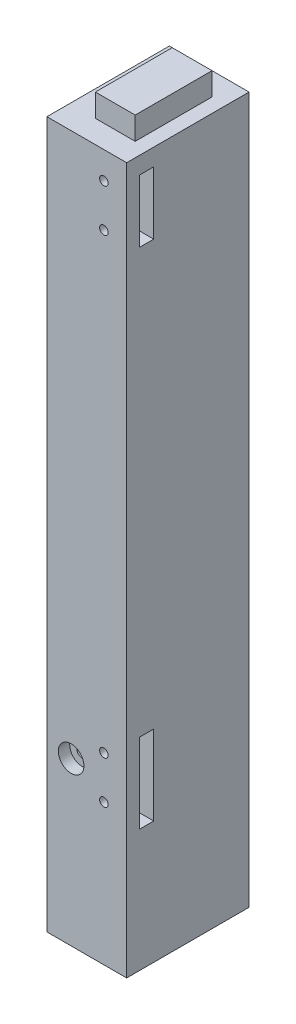
ISO-10303-21;
HEADER;
FILE_DESCRIPTION(('STEP AP214'),'2;1');
FILE_NAME('part.step','',(''),(''),'','','');
FILE_SCHEMA(('AUTOMOTIVE_DESIGN { 1 0 10303 214 1 1 1 1 }'));
ENDSEC;
DATA;
#1=APPLICATION_CONTEXT('core data for automotive mechanical design processes');
#2=APPLICATION_PROTOCOL_DEFINITION('international standard','automotive_design',2000,#1);
#3=PRODUCT_CONTEXT('',#1,'mechanical');
#4=PRODUCT('Part','Part','',(#3));
#5=PRODUCT_RELATED_PRODUCT_CATEGORY('part','',(#4));
#6=PRODUCT_DEFINITION_FORMATION('','',#4);
#7=PRODUCT_DEFINITION_CONTEXT('part definition',#1,'design');
#8=PRODUCT_DEFINITION('design','',#6,#7);
#9=PRODUCT_DEFINITION_SHAPE('','',#8);
#10=(LENGTH_UNIT() NAMED_UNIT(*) SI_UNIT(.MILLI.,.METRE.));
#11=(NAMED_UNIT(*) PLANE_ANGLE_UNIT() SI_UNIT($,.RADIAN.));
#12=(NAMED_UNIT(*) SI_UNIT($,.STERADIAN.) SOLID_ANGLE_UNIT());
#13=UNCERTAINTY_MEASURE_WITH_UNIT(LENGTH_MEASURE(1.E-05),#10,'distance_accuracy_value','');
#14=(GEOMETRIC_REPRESENTATION_CONTEXT(3) GLOBAL_UNCERTAINTY_ASSIGNED_CONTEXT((#13)) GLOBAL_UNIT_ASSIGNED_CONTEXT((#10,
#11,#12)) REPRESENTATION_CONTEXT('',''));
#15=CARTESIAN_POINT('',(0.,0.,0.));
#16=DIRECTION('',(0.,0.,1.));
#17=DIRECTION('',(1.,0.,0.));
#18=AXIS2_PLACEMENT_3D('',#15,#16,#17);
#19=CARTESIAN_POINT('',(-44.45,393.7,136.525));
#20=DIRECTION('',(1.,0.,0.));
#21=DIRECTION('',(0.,1.,0.));
#22=AXIS2_PLACEMENT_3D('',#19,#20,#21);
#23=PLANE('',#22);
#24=DIRECTION('',(0.,-1.,0.));
#25=VECTOR('',#24,1.);
#26=CARTESIAN_POINT('',(-44.45,393.7,0.));
#27=LINE('',#26,#25);
#28=CARTESIAN_POINT('',(-44.45,393.7,0.));
#29=VERTEX_POINT('',#28);
#30=CARTESIAN_POINT('',(-44.4499999999999,-393.7,0.));
#31=VERTEX_POINT('',#30);
#32=EDGE_CURVE('E298',#29,#31,#27,.T.);
#33=ORIENTED_EDGE('',*,*,#32,.T.);
#34=DIRECTION('',(0.,0.,-1.));
#35=VECTOR('',#34,1.);
#36=CARTESIAN_POINT('',(-44.4499999999999,-393.7,136.525));
#37=LINE('',#36,#35);
#38=CARTESIAN_POINT('',(-44.4499999999999,-393.7,136.525));
#39=VERTEX_POINT('',#38);
#40=EDGE_CURVE('E11',#39,#31,#37,.T.);
#41=ORIENTED_EDGE('',*,*,#40,.F.);
#42=DIRECTION('',(0.,-1.,0.));
#43=VECTOR('',#42,1.);
#44=CARTESIAN_POINT('',(-44.45,393.7,136.525));
#45=LINE('',#44,#43);
#46=CARTESIAN_POINT('',(-44.45,393.7,136.525));
#47=VERTEX_POINT('',#46);
#48=EDGE_CURVE('E306',#47,#39,#45,.T.);
#49=ORIENTED_EDGE('',*,*,#48,.F.);
#50=DIRECTION('',(0.,0.,-1.));
#51=VECTOR('',#50,1.);
#52=CARTESIAN_POINT('',(-44.45,393.7,136.525));
#53=LINE('',#52,#51);
#54=EDGE_CURVE('E316',#47,#29,#53,.T.);
#55=ORIENTED_EDGE('',*,*,#54,.T.);
#56=EDGE_LOOP('',(#33,#41,#49,#55));
#57=FACE_BOUND('',#56,.T.);
#58=ADVANCED_FACE('F33',(#57),#23,.F.);
#59=CARTESIAN_POINT('',(44.4500000000001,-393.7,136.525));
#60=DIRECTION('',(0.,1.,0.));
#61=DIRECTION('',(0.,0.,1.));
#62=AXIS2_PLACEMENT_3D('',#59,#60,#61);
#63=PLANE('',#62);
#64=DIRECTION('',(1.,0.,0.));
#65=VECTOR('',#64,1.);
#66=CARTESIAN_POINT('',(44.4500000000001,-393.7,0.));
#67=LINE('',#66,#65);
#68=CARTESIAN_POINT('',(44.4500000000001,-393.7,0.));
#69=VERTEX_POINT('',#68);
#70=EDGE_CURVE('E319',#31,#69,#67,.T.);
#71=ORIENTED_EDGE('',*,*,#70,.T.);
#72=DIRECTION('',(0.,0.,-1.));
#73=VECTOR('',#72,1.);
#74=CARTESIAN_POINT('',(44.4500000000001,-393.7,136.525));
#75=LINE('',#74,#73);
#76=CARTESIAN_POINT('',(44.4500000000001,-393.7,136.525));
#77=VERTEX_POINT('',#76);
#78=EDGE_CURVE('E41',#77,#69,#75,.T.);
#79=ORIENTED_EDGE('',*,*,#78,.F.);
#80=DIRECTION('',(1.,0.,0.));
#81=VECTOR('',#80,1.);
#82=CARTESIAN_POINT('',(44.4500000000001,-393.7,136.525));
#83=LINE('',#82,#81);
#84=EDGE_CURVE('E309',#39,#77,#83,.T.);
#85=ORIENTED_EDGE('',*,*,#84,.F.);
#86=ORIENTED_EDGE('',*,*,#40,.T.);
#87=EDGE_LOOP('',(#71,#79,#85,#86));
#88=FACE_BOUND('',#87,.T.);
#89=ADVANCED_FACE('F393',(#88),#63,.F.);
#90=CARTESIAN_POINT('',(44.45,393.7,136.525));
#91=DIRECTION('',(-1.,0.,0.));
#92=DIRECTION('',(0.,-1.,0.));
#93=AXIS2_PLACEMENT_3D('',#90,#91,#92);
#94=PLANE('',#93);
#95=DIRECTION('',(0.,0.,1.));
#96=VECTOR('',#95,1.);
#97=CARTESIAN_POINT('',(44.45,374.65,122.2375));
#98=LINE('',#97,#96);
#99=CARTESIAN_POINT('',(44.45,374.65,106.3625));
#100=VERTEX_POINT('',#99);
#101=CARTESIAN_POINT('',(44.45,374.65,122.2375));
#102=VERTEX_POINT('',#101);
#103=EDGE_CURVE('E228',#100,#102,#98,.T.);
#104=ORIENTED_EDGE('',*,*,#103,.F.);
#105=DIRECTION('',(0.,1.,0.));
#106=VECTOR('',#105,1.);
#107=CARTESIAN_POINT('',(44.45,374.65,106.3625));
#108=LINE('',#107,#106);
#109=CARTESIAN_POINT('',(44.45,304.8,106.3625));
#110=VERTEX_POINT('',#109);
#111=EDGE_CURVE('E57',#110,#100,#108,.T.);
#112=ORIENTED_EDGE('',*,*,#111,.F.);
#113=DIRECTION('',(0.,0.,-1.));
#114=VECTOR('',#113,1.);
#115=CARTESIAN_POINT('',(44.45,304.8,122.2375));
#116=LINE('',#115,#114);
#117=CARTESIAN_POINT('',(44.45,304.8,122.2375));
#118=VERTEX_POINT('',#117);
#119=EDGE_CURVE('E217',#118,#110,#116,.T.);
#120=ORIENTED_EDGE('',*,*,#119,.F.);
#121=DIRECTION('',(0.,-1.,0.));
#122=VECTOR('',#121,1.);
#123=CARTESIAN_POINT('',(44.45,374.65,122.2375));
#124=LINE('',#123,#122);
#125=EDGE_CURVE('E231',#102,#118,#124,.T.);
#126=ORIENTED_EDGE('',*,*,#125,.F.);
#127=EDGE_LOOP('',(#104,#112,#120,#126));
#128=FACE_BOUND('',#127,.T.);
#129=DIRECTION('',(0.,0.,1.));
#130=VECTOR('',#129,1.);
#131=CARTESIAN_POINT('',(44.45,-168.275,122.2375));
#132=LINE('',#131,#130);
#133=CARTESIAN_POINT('',(44.45,-168.275,106.3625));
#134=VERTEX_POINT('',#133);
#135=CARTESIAN_POINT('',(44.45,-168.275,122.2375));
#136=VERTEX_POINT('',#135);
#137=EDGE_CURVE('E259',#134,#136,#132,.T.);
#138=ORIENTED_EDGE('',*,*,#137,.F.);
#139=DIRECTION('',(0.,1.,0.));
#140=VECTOR('',#139,1.);
#141=CARTESIAN_POINT('',(44.45,-168.275,106.3625));
#142=LINE('',#141,#140);
#143=CARTESIAN_POINT('',(44.45,-257.175,106.3625));
#144=VERTEX_POINT('',#143);
#145=EDGE_CURVE('E238',#144,#134,#142,.T.);
#146=ORIENTED_EDGE('',*,*,#145,.F.);
#147=DIRECTION('',(0.,0.,-1.));
#148=VECTOR('',#147,1.);
#149=CARTESIAN_POINT('',(44.45,-257.175,122.2375));
#150=LINE('',#149,#148);
#151=CARTESIAN_POINT('',(44.45,-257.175,122.2375));
#152=VERTEX_POINT('',#151);
#153=EDGE_CURVE('E248',#152,#144,#150,.T.);
#154=ORIENTED_EDGE('',*,*,#153,.F.);
#155=DIRECTION('',(0.,-1.,0.));
#156=VECTOR('',#155,1.);
#157=CARTESIAN_POINT('',(44.45,-168.275,122.2375));
#158=LINE('',#157,#156);
#159=EDGE_CURVE('E262',#136,#152,#158,.T.);
#160=ORIENTED_EDGE('',*,*,#159,.F.);
#161=EDGE_LOOP('',(#138,#146,#154,#160));
#162=FACE_BOUND('',#161,.T.);
#163=DIRECTION('',(0.,1.,0.));
#164=VECTOR('',#163,1.);
#165=CARTESIAN_POINT('',(44.45,393.7,0.));
#166=LINE('',#165,#164);
#167=CARTESIAN_POINT('',(44.45,393.7,0.));
#168=VERTEX_POINT('',#167);
#169=EDGE_CURVE('E321',#69,#168,#166,.T.);
#170=ORIENTED_EDGE('',*,*,#169,.T.);
#171=DIRECTION('',(0.,0.,-1.));
#172=VECTOR('',#171,1.);
#173=CARTESIAN_POINT('',(44.45,393.7,136.525));
#174=LINE('',#173,#172);
#175=CARTESIAN_POINT('',(44.45,393.7,136.525));
#176=VERTEX_POINT('',#175);
#177=EDGE_CURVE('E326',#176,#168,#174,.T.);
#178=ORIENTED_EDGE('',*,*,#177,.F.);
#179=DIRECTION('',(0.,1.,0.));
#180=VECTOR('',#179,1.);
#181=CARTESIAN_POINT('',(44.45,393.7,136.525));
#182=LINE('',#181,#180);
#183=EDGE_CURVE('E312',#77,#176,#182,.T.);
#184=ORIENTED_EDGE('',*,*,#183,.F.);
#185=ORIENTED_EDGE('',*,*,#78,.T.);
#186=EDGE_LOOP('',(#170,#178,#184,#185));
#187=FACE_BOUND('',#186,.T.);
#188=ADVANCED_FACE('F398',(#128,#162,#187),#94,.F.);
#189=CARTESIAN_POINT('',(44.45,393.7,136.525));
#190=DIRECTION('',(0.,-1.,0.));
#191=DIRECTION('',(0.,0.,-1.));
#192=AXIS2_PLACEMENT_3D('',#189,#190,#191);
#193=PLANE('',#192);
#194=DIRECTION('',(0.,0.,1.));
#195=VECTOR('',#194,1.);
#196=CARTESIAN_POINT('',(-15.875,393.7,25.4));
#197=LINE('',#196,#195);
#198=CARTESIAN_POINT('',(-15.875,393.7,25.4));
#199=VERTEX_POINT('',#198);
#200=CARTESIAN_POINT('',(-15.875,393.7,111.125));
#201=VERTEX_POINT('',#200);
#202=EDGE_CURVE('E280',#199,#201,#197,.T.);
#203=ORIENTED_EDGE('',*,*,#202,.F.);
#204=DIRECTION('',(1.,0.,0.));
#205=VECTOR('',#204,1.);
#206=CARTESIAN_POINT('',(-15.875,393.7,25.4));
#207=LINE('',#206,#205);
#208=CARTESIAN_POINT('',(28.5749999999999,393.7,25.4));
#209=VERTEX_POINT('',#208);
#210=EDGE_CURVE('E269',#199,#209,#207,.T.);
#211=ORIENTED_EDGE('',*,*,#210,.T.);
#212=DIRECTION('',(0.,0.,1.));
#213=VECTOR('',#212,1.);
#214=CARTESIAN_POINT('',(28.5749999999999,393.7,25.4));
#215=LINE('',#214,#213);
#216=CARTESIAN_POINT('',(28.575,393.7,111.125));
#217=VERTEX_POINT('',#216);
#218=EDGE_CURVE('E290',#209,#217,#215,.T.);
#219=ORIENTED_EDGE('',*,*,#218,.T.);
#220=DIRECTION('',(1.,0.,0.));
#221=VECTOR('',#220,1.);
#222=CARTESIAN_POINT('',(-15.875,393.7,111.125));
#223=LINE('',#222,#221);
#224=EDGE_CURVE('E293',#201,#217,#223,.T.);
#225=ORIENTED_EDGE('',*,*,#224,.F.);
#226=EDGE_LOOP('',(#203,#211,#219,#225));
#227=FACE_BOUND('',#226,.T.);
#228=DIRECTION('',(-1.,0.,0.));
#229=VECTOR('',#228,1.);
#230=CARTESIAN_POINT('',(44.45,393.7,0.));
#231=LINE('',#230,#229);
#232=EDGE_CURVE('E310',#168,#29,#231,.T.);
#233=ORIENTED_EDGE('',*,*,#232,.T.);
#234=ORIENTED_EDGE('',*,*,#54,.F.);
#235=DIRECTION('',(-1.,0.,0.));
#236=VECTOR('',#235,1.);
#237=CARTESIAN_POINT('',(44.45,393.7,136.525));
#238=LINE('',#237,#236);
#239=EDGE_CURVE('E314',#176,#47,#238,.T.);
#240=ORIENTED_EDGE('',*,*,#239,.F.);
#241=ORIENTED_EDGE('',*,*,#177,.T.);
#242=EDGE_LOOP('',(#233,#234,#240,#241));
#243=FACE_BOUND('',#242,.T.);
#244=ADVANCED_FACE('F382',(#227,#243),#193,.F.);
#245=CARTESIAN_POINT('',(0.,0.,136.525));
#246=DIRECTION('',(0.,0.,-1.));
#247=DIRECTION('',(-1.,0.,0.));
#248=AXIS2_PLACEMENT_3D('',#245,#246,#247);
#249=PLANE('',#248);
#250=CARTESIAN_POINT('',(19.05,363.5375,136.525));
#251=DIRECTION('',(0.,0.,1.));
#252=DIRECTION('',(1.,0.,0.));
#253=AXIS2_PLACEMENT_3D('',#250,#251,#252);
#254=CIRCLE('',#253,4.7625);
#255=CARTESIAN_POINT('',(23.8125,363.5375,136.525));
#256=VERTEX_POINT('',#255);
#257=EDGE_CURVE('E578',#256,#256,#254,.T.);
#258=ORIENTED_EDGE('',*,*,#257,.F.);
#259=EDGE_LOOP('',(#258));
#260=FACE_BOUND('',#259,.T.);
#261=CARTESIAN_POINT('',(19.05,-188.9125,136.525));
#262=DIRECTION('',(0.,0.,1.));
#263=DIRECTION('',(1.,0.,0.));
#264=AXIS2_PLACEMENT_3D('',#261,#262,#263);
#265=CIRCLE('',#264,4.7625);
#266=CARTESIAN_POINT('',(23.8125,-188.9125,136.525));
#267=VERTEX_POINT('',#266);
#268=EDGE_CURVE('E577',#267,#267,#265,.T.);
#269=ORIENTED_EDGE('',*,*,#268,.F.);
#270=EDGE_LOOP('',(#269));
#271=FACE_BOUND('',#270,.T.);
#272=CARTESIAN_POINT('',(19.05,315.9125,136.525));
#273=DIRECTION('',(0.,0.,1.));
#274=DIRECTION('',(1.,0.,0.));
#275=AXIS2_PLACEMENT_3D('',#272,#273,#274);
#276=CIRCLE('',#275,4.7625);
#277=CARTESIAN_POINT('',(23.8125,315.9125,136.525));
#278=VERTEX_POINT('',#277);
#279=EDGE_CURVE('E339',#278,#278,#276,.T.);
#280=ORIENTED_EDGE('',*,*,#279,.F.);
#281=EDGE_LOOP('',(#280));
#282=FACE_BOUND('',#281,.T.);
#283=CARTESIAN_POINT('',(19.05,-236.5375,136.525));
#284=DIRECTION('',(0.,0.,1.));
#285=DIRECTION('',(1.,0.,0.));
#286=AXIS2_PLACEMENT_3D('',#283,#284,#285);
#287=CIRCLE('',#286,4.7625);
#288=CARTESIAN_POINT('',(23.8125,-236.5375,136.525));
#289=VERTEX_POINT('',#288);
#290=EDGE_CURVE('E358',#289,#289,#287,.T.);
#291=ORIENTED_EDGE('',*,*,#290,.F.);
#292=EDGE_LOOP('',(#291));
#293=FACE_BOUND('',#292,.T.);
#294=CARTESIAN_POINT('',(-17.4625,-212.725,136.525));
#295=DIRECTION('',(0.,0.,1.));
#296=DIRECTION('',(1.,0.,0.));
#297=AXIS2_PLACEMENT_3D('',#294,#295,#296);
#298=CIRCLE('',#297,14.2875);
#299=CARTESIAN_POINT('',(-3.17500000000005,-212.725,136.525));
#300=VERTEX_POINT('',#299);
#301=EDGE_CURVE('E197',#300,#300,#298,.T.);
#302=ORIENTED_EDGE('',*,*,#301,.F.);
#303=EDGE_LOOP('',(#302));
#304=FACE_BOUND('',#303,.T.);
#305=ORIENTED_EDGE('',*,*,#48,.T.);
#306=ORIENTED_EDGE('',*,*,#84,.T.);
#307=ORIENTED_EDGE('',*,*,#183,.T.);
#308=ORIENTED_EDGE('',*,*,#239,.T.);
#309=EDGE_LOOP('',(#305,#306,#307,#308));
#310=FACE_BOUND('',#309,.T.);
#311=ADVANCED_FACE('F378',(#260,#271,#282,#293,#304,#310),#249,.F.);
#312=CARTESIAN_POINT('',(0.,0.,0.));
#313=DIRECTION('',(0.,0.,-1.));
#314=DIRECTION('',(-1.,0.,0.));
#315=AXIS2_PLACEMENT_3D('',#312,#313,#314);
#316=PLANE('',#315);
#317=DIRECTION('',(0.,-1.,0.));
#318=VECTOR('',#317,1.);
#319=CARTESIAN_POINT('',(-4.76250000000003,-171.45,0.));
#320=LINE('',#319,#318);
#321=CARTESIAN_POINT('',(-4.76250000000003,-171.45,0.));
#322=VERTEX_POINT('',#321);
#323=CARTESIAN_POINT('',(-4.76250000000004,-254.,0.));
#324=VERTEX_POINT('',#323);
#325=EDGE_CURVE('E49',#322,#324,#320,.T.);
#326=ORIENTED_EDGE('',*,*,#325,.F.);
#327=DIRECTION('',(1.,0.,0.));
#328=VECTOR('',#327,1.);
#329=CARTESIAN_POINT('',(-30.1625,-171.45,0.));
#330=LINE('',#329,#328);
#331=CARTESIAN_POINT('',(-30.1625,-171.45,0.));
#332=VERTEX_POINT('',#331);
#333=EDGE_CURVE('E191',#332,#322,#330,.T.);
#334=ORIENTED_EDGE('',*,*,#333,.F.);
#335=DIRECTION('',(0.,1.,0.));
#336=VECTOR('',#335,1.);
#337=CARTESIAN_POINT('',(-30.1625,-171.45,0.));
#338=LINE('',#337,#336);
#339=CARTESIAN_POINT('',(-30.1625,-254.,0.));
#340=VERTEX_POINT('',#339);
#341=EDGE_CURVE('E194',#340,#332,#338,.T.);
#342=ORIENTED_EDGE('',*,*,#341,.F.);
#343=DIRECTION('',(-1.,0.,0.));
#344=VECTOR('',#343,1.);
#345=CARTESIAN_POINT('',(-30.1625,-254.,0.));
#346=LINE('',#345,#344);
#347=EDGE_CURVE('E203',#324,#340,#346,.T.);
#348=ORIENTED_EDGE('',*,*,#347,.F.);
#349=EDGE_LOOP('',(#326,#334,#342,#348));
#350=FACE_BOUND('',#349,.T.);
#351=ORIENTED_EDGE('',*,*,#32,.F.);
#352=ORIENTED_EDGE('',*,*,#232,.F.);
#353=ORIENTED_EDGE('',*,*,#169,.F.);
#354=ORIENTED_EDGE('',*,*,#70,.F.);
#355=EDGE_LOOP('',(#351,#352,#353,#354));
#356=FACE_BOUND('',#355,.T.);
#357=ADVANCED_FACE('F381',(#350,#356),#316,.T.);
#358=CARTESIAN_POINT('',(-15.875,419.1,25.4));
#359=DIRECTION('',(0.,0.,-1.));
#360=DIRECTION('',(-1.,0.,0.));
#361=AXIS2_PLACEMENT_3D('',#358,#359,#360);
#362=PLANE('',#361);
#363=ORIENTED_EDGE('',*,*,#210,.F.);
#364=DIRECTION('',(0.,-1.,0.));
#365=VECTOR('',#364,1.);
#366=CARTESIAN_POINT('',(-15.875,419.1,25.4));
#367=LINE('',#366,#365);
#368=CARTESIAN_POINT('',(-15.875,419.1,25.4));
#369=VERTEX_POINT('',#368);
#370=EDGE_CURVE('E296',#369,#199,#367,.T.);
#371=ORIENTED_EDGE('',*,*,#370,.F.);
#372=DIRECTION('',(1.,0.,0.));
#373=VECTOR('',#372,1.);
#374=CARTESIAN_POINT('',(-15.875,419.1,25.4));
#375=LINE('',#374,#373);
#376=CARTESIAN_POINT('',(28.5749999999999,419.1,25.4));
#377=VERTEX_POINT('',#376);
#378=EDGE_CURVE('E276',#369,#377,#375,.T.);
#379=ORIENTED_EDGE('',*,*,#378,.T.);
#380=DIRECTION('',(0.,-1.,0.));
#381=VECTOR('',#380,1.);
#382=CARTESIAN_POINT('',(28.5749999999999,419.1,25.4));
#383=LINE('',#382,#381);
#384=EDGE_CURVE('E287',#377,#209,#383,.T.);
#385=ORIENTED_EDGE('',*,*,#384,.T.);
#386=EDGE_LOOP('',(#363,#371,#379,#385));
#387=FACE_BOUND('',#386,.T.);
#388=ADVANCED_FACE('F403',(#387),#362,.T.);
#389=CARTESIAN_POINT('',(-15.875,419.1,25.4));
#390=DIRECTION('',(1.,0.,0.));
#391=DIRECTION('',(0.,0.,-1.));
#392=AXIS2_PLACEMENT_3D('',#389,#390,#391);
#393=PLANE('',#392);
#394=ORIENTED_EDGE('',*,*,#202,.T.);
#395=DIRECTION('',(0.,-1.,0.));
#396=VECTOR('',#395,1.);
#397=CARTESIAN_POINT('',(-15.875,419.1,111.125));
#398=LINE('',#397,#396);
#399=CARTESIAN_POINT('',(-15.875,419.1,111.125));
#400=VERTEX_POINT('',#399);
#401=EDGE_CURVE('E299',#400,#201,#398,.T.);
#402=ORIENTED_EDGE('',*,*,#401,.F.);
#403=DIRECTION('',(0.,0.,1.));
#404=VECTOR('',#403,1.);
#405=CARTESIAN_POINT('',(-15.875,419.1,25.4));
#406=LINE('',#405,#404);
#407=EDGE_CURVE('E285',#369,#400,#406,.T.);
#408=ORIENTED_EDGE('',*,*,#407,.F.);
#409=ORIENTED_EDGE('',*,*,#370,.T.);
#410=EDGE_LOOP('',(#394,#402,#408,#409));
#411=FACE_BOUND('',#410,.T.);
#412=ADVANCED_FACE('F409',(#411),#393,.F.);
#413=CARTESIAN_POINT('',(-15.875,419.1,111.125));
#414=DIRECTION('',(0.,0.,-1.));
#415=DIRECTION('',(-1.,0.,0.));
#416=AXIS2_PLACEMENT_3D('',#413,#414,#415);
#417=PLANE('',#416);
#418=ORIENTED_EDGE('',*,*,#224,.T.);
#419=DIRECTION('',(0.,-1.,0.));
#420=VECTOR('',#419,1.);
#421=CARTESIAN_POINT('',(28.575,419.1,111.125));
#422=LINE('',#421,#420);
#423=CARTESIAN_POINT('',(28.575,419.1,111.125));
#424=VERTEX_POINT('',#423);
#425=EDGE_CURVE('E302',#424,#217,#422,.T.);
#426=ORIENTED_EDGE('',*,*,#425,.F.);
#427=DIRECTION('',(1.,0.,0.));
#428=VECTOR('',#427,1.);
#429=CARTESIAN_POINT('',(-15.875,419.1,111.125));
#430=LINE('',#429,#428);
#431=EDGE_CURVE('E283',#400,#424,#430,.T.);
#432=ORIENTED_EDGE('',*,*,#431,.F.);
#433=ORIENTED_EDGE('',*,*,#401,.T.);
#434=EDGE_LOOP('',(#418,#426,#432,#433));
#435=FACE_BOUND('',#434,.T.);
#436=ADVANCED_FACE('F434',(#435),#417,.F.);
#437=CARTESIAN_POINT('',(28.5749999999999,419.1,25.4));
#438=DIRECTION('',(1.,0.,0.));
#439=DIRECTION('',(0.,0.,-1.));
#440=AXIS2_PLACEMENT_3D('',#437,#438,#439);
#441=PLANE('',#440);
#442=ORIENTED_EDGE('',*,*,#218,.F.);
#443=ORIENTED_EDGE('',*,*,#384,.F.);
#444=DIRECTION('',(0.,0.,1.));
#445=VECTOR('',#444,1.);
#446=CARTESIAN_POINT('',(28.5749999999999,419.1,25.4));
#447=LINE('',#446,#445);
#448=EDGE_CURVE('E279',#377,#424,#447,.T.);
#449=ORIENTED_EDGE('',*,*,#448,.T.);
#450=ORIENTED_EDGE('',*,*,#425,.T.);
#451=EDGE_LOOP('',(#442,#443,#449,#450));
#452=FACE_BOUND('',#451,.T.);
#453=ADVANCED_FACE('F442',(#452),#441,.T.);
#454=CARTESIAN_POINT('',(0.,419.1,0.));
#455=DIRECTION('',(0.,-1.,0.));
#456=DIRECTION('',(0.,0.,-1.));
#457=AXIS2_PLACEMENT_3D('',#454,#455,#456);
#458=PLANE('',#457);
#459=ORIENTED_EDGE('',*,*,#378,.F.);
#460=ORIENTED_EDGE('',*,*,#407,.T.);
#461=ORIENTED_EDGE('',*,*,#431,.T.);
#462=ORIENTED_EDGE('',*,*,#448,.F.);
#463=EDGE_LOOP('',(#459,#460,#461,#462));
#464=FACE_BOUND('',#463,.T.);
#465=ADVANCED_FACE('F439',(#464),#458,.F.);
#466=CARTESIAN_POINT('',(-6.34999999999997,-168.275,106.3625));
#467=DIRECTION('',(0.,0.,-1.));
#468=DIRECTION('',(0.,1.,0.));
#469=AXIS2_PLACEMENT_3D('',#466,#467,#468);
#470=PLANE('',#469);
#471=CARTESIAN_POINT('',(19.05,-188.9125,106.3625));
#472=DIRECTION('',(0.,0.,-1.));
#473=DIRECTION('',(0.,1.,0.));
#474=AXIS2_PLACEMENT_3D('',#471,#472,#473);
#475=CIRCLE('',#474,4.7625);
#476=CARTESIAN_POINT('',(19.05,-184.15,106.3625));
#477=VERTEX_POINT('',#476);
#478=EDGE_CURVE('E355',#477,#477,#475,.T.);
#479=ORIENTED_EDGE('',*,*,#478,.T.);
#480=EDGE_LOOP('',(#479));
#481=FACE_BOUND('',#480,.T.);
#482=CARTESIAN_POINT('',(19.05,-236.5375,106.3625));
#483=DIRECTION('',(0.,0.,-1.));
#484=DIRECTION('',(0.,1.,0.));
#485=AXIS2_PLACEMENT_3D('',#482,#483,#484);
#486=CIRCLE('',#485,4.7625);
#487=CARTESIAN_POINT('',(19.05,-231.775,106.3625));
#488=VERTEX_POINT('',#487);
#489=EDGE_CURVE('E334',#488,#488,#486,.T.);
#490=ORIENTED_EDGE('',*,*,#489,.T.);
#491=EDGE_LOOP('',(#490));
#492=FACE_BOUND('',#491,.T.);
#493=ORIENTED_EDGE('',*,*,#145,.T.);
#494=DIRECTION('',(1.,0.,0.));
#495=VECTOR('',#494,1.);
#496=CARTESIAN_POINT('',(-6.34999999999997,-168.275,106.3625));
#497=LINE('',#496,#495);
#498=CARTESIAN_POINT('',(-6.34999999999997,-168.275,106.3625));
#499=VERTEX_POINT('',#498);
#500=EDGE_CURVE('E257',#499,#134,#497,.T.);
#501=ORIENTED_EDGE('',*,*,#500,.F.);
#502=DIRECTION('',(0.,1.,0.));
#503=VECTOR('',#502,1.);
#504=CARTESIAN_POINT('',(-6.34999999999997,-168.275,106.3625));
#505=LINE('',#504,#503);
#506=CARTESIAN_POINT('',(-6.34999999999997,-257.175,106.3625));
#507=VERTEX_POINT('',#506);
#508=EDGE_CURVE('E244',#507,#499,#505,.T.);
#509=ORIENTED_EDGE('',*,*,#508,.F.);
#510=DIRECTION('',(1.,0.,0.));
#511=VECTOR('',#510,1.);
#512=CARTESIAN_POINT('',(-6.34999999999997,-257.175,106.3625));
#513=LINE('',#512,#511);
#514=EDGE_CURVE('E267',#507,#144,#513,.T.);
#515=ORIENTED_EDGE('',*,*,#514,.T.);
#516=EDGE_LOOP('',(#493,#501,#509,#515));
#517=FACE_BOUND('',#516,.T.);
#518=ADVANCED_FACE('F449',(#481,#492,#517),#470,.F.);
#519=CARTESIAN_POINT('',(-6.34999999999997,-257.175,122.2375));
#520=DIRECTION('',(0.,-1.,0.));
#521=DIRECTION('',(1.,0.,0.));
#522=AXIS2_PLACEMENT_3D('',#519,#520,#521);
#523=PLANE('',#522);
#524=ORIENTED_EDGE('',*,*,#153,.T.);
#525=ORIENTED_EDGE('',*,*,#514,.F.);
#526=DIRECTION('',(0.,0.,-1.));
#527=VECTOR('',#526,1.);
#528=CARTESIAN_POINT('',(-6.34999999999997,-257.175,122.2375));
#529=LINE('',#528,#527);
#530=CARTESIAN_POINT('',(-6.34999999999997,-257.175,122.2375));
#531=VERTEX_POINT('',#530);
#532=EDGE_CURVE('E254',#531,#507,#529,.T.);
#533=ORIENTED_EDGE('',*,*,#532,.F.);
#534=DIRECTION('',(1.,0.,0.));
#535=VECTOR('',#534,1.);
#536=CARTESIAN_POINT('',(-6.34999999999997,-257.175,122.2375));
#537=LINE('',#536,#535);
#538=EDGE_CURVE('E270',#531,#152,#537,.T.);
#539=ORIENTED_EDGE('',*,*,#538,.T.);
#540=EDGE_LOOP('',(#524,#525,#533,#539));
#541=FACE_BOUND('',#540,.T.);
#542=ADVANCED_FACE('F457',(#541),#523,.F.);
#543=CARTESIAN_POINT('',(-6.34999999999997,-168.275,122.2375));
#544=DIRECTION('',(0.,0.,1.));
#545=DIRECTION('',(0.,-1.,0.));
#546=AXIS2_PLACEMENT_3D('',#543,#544,#545);
#547=PLANE('',#546);
#548=CARTESIAN_POINT('',(19.05,-188.9125,122.2375));
#549=DIRECTION('',(0.,0.,1.));
#550=DIRECTION('',(0.,-1.,0.));
#551=AXIS2_PLACEMENT_3D('',#548,#549,#550);
#552=CIRCLE('',#551,4.7625);
#553=CARTESIAN_POINT('',(19.05,-193.675,122.2375));
#554=VERTEX_POINT('',#553);
#555=EDGE_CURVE('E36',#554,#554,#552,.T.);
#556=ORIENTED_EDGE('',*,*,#555,.T.);
#557=EDGE_LOOP('',(#556));
#558=FACE_BOUND('',#557,.T.);
#559=CARTESIAN_POINT('',(19.05,-236.5375,122.2375));
#560=DIRECTION('',(0.,0.,1.));
#561=DIRECTION('',(0.,-1.,0.));
#562=AXIS2_PLACEMENT_3D('',#559,#560,#561);
#563=CIRCLE('',#562,4.7625);
#564=CARTESIAN_POINT('',(19.05,-241.3,122.2375));
#565=VERTEX_POINT('',#564);
#566=EDGE_CURVE('E331',#565,#565,#563,.T.);
#567=ORIENTED_EDGE('',*,*,#566,.T.);
#568=EDGE_LOOP('',(#567));
#569=FACE_BOUND('',#568,.T.);
#570=ORIENTED_EDGE('',*,*,#159,.T.);
#571=ORIENTED_EDGE('',*,*,#538,.F.);
#572=DIRECTION('',(0.,-1.,0.));
#573=VECTOR('',#572,1.);
#574=CARTESIAN_POINT('',(-6.34999999999997,-168.275,122.2375));
#575=LINE('',#574,#573);
#576=CARTESIAN_POINT('',(-6.34999999999997,-168.275,122.2375));
#577=VERTEX_POINT('',#576);
#578=EDGE_CURVE('E251',#577,#531,#575,.T.);
#579=ORIENTED_EDGE('',*,*,#578,.F.);
#580=DIRECTION('',(1.,0.,0.));
#581=VECTOR('',#580,1.);
#582=CARTESIAN_POINT('',(-6.34999999999997,-168.275,122.2375));
#583=LINE('',#582,#581);
#584=EDGE_CURVE('E272',#577,#136,#583,.T.);
#585=ORIENTED_EDGE('',*,*,#584,.T.);
#586=EDGE_LOOP('',(#570,#571,#579,#585));
#587=FACE_BOUND('',#586,.T.);
#588=ADVANCED_FACE('F463',(#558,#569,#587),#547,.F.);
#589=CARTESIAN_POINT('',(-6.34999999999997,-168.275,122.2375));
#590=DIRECTION('',(0.,1.,0.));
#591=DIRECTION('',(-1.,0.,0.));
#592=AXIS2_PLACEMENT_3D('',#589,#590,#591);
#593=PLANE('',#592);
#594=ORIENTED_EDGE('',*,*,#137,.T.);
#595=ORIENTED_EDGE('',*,*,#584,.F.);
#596=DIRECTION('',(0.,0.,1.));
#597=VECTOR('',#596,1.);
#598=CARTESIAN_POINT('',(-6.34999999999997,-168.275,122.2375));
#599=LINE('',#598,#597);
#600=EDGE_CURVE('E247',#499,#577,#599,.T.);
#601=ORIENTED_EDGE('',*,*,#600,.F.);
#602=ORIENTED_EDGE('',*,*,#500,.T.);
#603=EDGE_LOOP('',(#594,#595,#601,#602));
#604=FACE_BOUND('',#603,.T.);
#605=ADVANCED_FACE('F459',(#604),#593,.F.);
#606=CARTESIAN_POINT('',(-6.34999999999999,0.,0.));
#607=DIRECTION('',(1.,0.,0.));
#608=DIRECTION('',(0.,1.,0.));
#609=AXIS2_PLACEMENT_3D('',#606,#607,#608);
#610=PLANE('',#609);
#611=ORIENTED_EDGE('',*,*,#508,.T.);
#612=ORIENTED_EDGE('',*,*,#600,.T.);
#613=ORIENTED_EDGE('',*,*,#578,.T.);
#614=ORIENTED_EDGE('',*,*,#532,.T.);
#615=EDGE_LOOP('',(#611,#612,#613,#614));
#616=FACE_BOUND('',#615,.T.);
#617=ADVANCED_FACE('F462',(#616),#610,.T.);
#618=CARTESIAN_POINT('',(-6.35000000000004,374.65,106.3625));
#619=DIRECTION('',(0.,0.,-1.));
#620=DIRECTION('',(0.,1.,0.));
#621=AXIS2_PLACEMENT_3D('',#618,#619,#620);
#622=PLANE('',#621);
#623=CARTESIAN_POINT('',(19.05,363.5375,106.3625));
#624=DIRECTION('',(0.,0.,-1.));
#625=DIRECTION('',(0.,1.,0.));
#626=AXIS2_PLACEMENT_3D('',#623,#624,#625);
#627=CIRCLE('',#626,4.7625);
#628=CARTESIAN_POINT('',(19.05,368.3,106.3625));
#629=VERTEX_POINT('',#628);
#630=EDGE_CURVE('E342',#629,#629,#627,.T.);
#631=ORIENTED_EDGE('',*,*,#630,.T.);
#632=EDGE_LOOP('',(#631));
#633=FACE_BOUND('',#632,.T.);
#634=CARTESIAN_POINT('',(19.05,315.9125,106.3625));
#635=DIRECTION('',(0.,0.,-1.));
#636=DIRECTION('',(0.,1.,0.));
#637=AXIS2_PLACEMENT_3D('',#634,#635,#636);
#638=CIRCLE('',#637,4.7625);
#639=CARTESIAN_POINT('',(19.05,320.675,106.3625));
#640=VERTEX_POINT('',#639);
#641=EDGE_CURVE('E338',#640,#640,#638,.T.);
#642=ORIENTED_EDGE('',*,*,#641,.T.);
#643=EDGE_LOOP('',(#642));
#644=FACE_BOUND('',#643,.T.);
#645=ORIENTED_EDGE('',*,*,#111,.T.);
#646=DIRECTION('',(1.,0.,0.));
#647=VECTOR('',#646,1.);
#648=CARTESIAN_POINT('',(-6.35000000000004,374.65,106.3625));
#649=LINE('',#648,#647);
#650=CARTESIAN_POINT('',(-6.35000000000004,374.65,106.3625));
#651=VERTEX_POINT('',#650);
#652=EDGE_CURVE('E226',#651,#100,#649,.T.);
#653=ORIENTED_EDGE('',*,*,#652,.F.);
#654=DIRECTION('',(0.,1.,0.));
#655=VECTOR('',#654,1.);
#656=CARTESIAN_POINT('',(-6.35000000000004,374.65,106.3625));
#657=LINE('',#656,#655);
#658=CARTESIAN_POINT('',(-6.35000000000003,304.8,106.3625));
#659=VERTEX_POINT('',#658);
#660=EDGE_CURVE('E213',#659,#651,#657,.T.);
#661=ORIENTED_EDGE('',*,*,#660,.F.);
#662=DIRECTION('',(1.,0.,0.));
#663=VECTOR('',#662,1.);
#664=CARTESIAN_POINT('',(-6.35000000000003,304.8,106.3625));
#665=LINE('',#664,#663);
#666=EDGE_CURVE('E236',#659,#110,#665,.T.);
#667=ORIENTED_EDGE('',*,*,#666,.T.);
#668=EDGE_LOOP('',(#645,#653,#661,#667));
#669=FACE_BOUND('',#668,.T.);
#670=ADVANCED_FACE('F473',(#633,#644,#669),#622,.F.);
#671=CARTESIAN_POINT('',(-6.35000000000003,304.8,122.2375));
#672=DIRECTION('',(0.,-1.,0.));
#673=DIRECTION('',(1.,0.,0.));
#674=AXIS2_PLACEMENT_3D('',#671,#672,#673);
#675=PLANE('',#674);
#676=ORIENTED_EDGE('',*,*,#119,.T.);
#677=ORIENTED_EDGE('',*,*,#666,.F.);
#678=DIRECTION('',(0.,0.,-1.));
#679=VECTOR('',#678,1.);
#680=CARTESIAN_POINT('',(-6.35000000000003,304.8,122.2375));
#681=LINE('',#680,#679);
#682=CARTESIAN_POINT('',(-6.35000000000003,304.8,122.2375));
#683=VERTEX_POINT('',#682);
#684=EDGE_CURVE('E223',#683,#659,#681,.T.);
#685=ORIENTED_EDGE('',*,*,#684,.F.);
#686=DIRECTION('',(1.,0.,0.));
#687=VECTOR('',#686,1.);
#688=CARTESIAN_POINT('',(-6.35000000000003,304.8,122.2375));
#689=LINE('',#688,#687);
#690=EDGE_CURVE('E239',#683,#118,#689,.T.);
#691=ORIENTED_EDGE('',*,*,#690,.T.);
#692=EDGE_LOOP('',(#676,#677,#685,#691));
#693=FACE_BOUND('',#692,.T.);
#694=ADVANCED_FACE('F477',(#693),#675,.F.);
#695=CARTESIAN_POINT('',(-6.35000000000004,374.65,122.2375));
#696=DIRECTION('',(0.,0.,1.));
#697=DIRECTION('',(0.,-1.,0.));
#698=AXIS2_PLACEMENT_3D('',#695,#696,#697);
#699=PLANE('',#698);
#700=CARTESIAN_POINT('',(19.05,363.5375,122.2375));
#701=DIRECTION('',(0.,0.,1.));
#702=DIRECTION('',(0.,-1.,0.));
#703=AXIS2_PLACEMENT_3D('',#700,#701,#702);
#704=CIRCLE('',#703,4.7625);
#705=CARTESIAN_POINT('',(19.05,358.775,122.2375));
#706=VERTEX_POINT('',#705);
#707=EDGE_CURVE('E340',#706,#706,#704,.T.);
#708=ORIENTED_EDGE('',*,*,#707,.T.);
#709=EDGE_LOOP('',(#708));
#710=FACE_BOUND('',#709,.T.);
#711=CARTESIAN_POINT('',(19.05,315.9125,122.2375));
#712=DIRECTION('',(0.,0.,1.));
#713=DIRECTION('',(0.,-1.,0.));
#714=AXIS2_PLACEMENT_3D('',#711,#712,#713);
#715=CIRCLE('',#714,4.7625);
#716=CARTESIAN_POINT('',(19.05,311.15,122.2375));
#717=VERTEX_POINT('',#716);
#718=EDGE_CURVE('E336',#717,#717,#715,.T.);
#719=ORIENTED_EDGE('',*,*,#718,.T.);
#720=EDGE_LOOP('',(#719));
#721=FACE_BOUND('',#720,.T.);
#722=ORIENTED_EDGE('',*,*,#125,.T.);
#723=ORIENTED_EDGE('',*,*,#690,.F.);
#724=DIRECTION('',(0.,-1.,0.));
#725=VECTOR('',#724,1.);
#726=CARTESIAN_POINT('',(-6.35000000000004,374.65,122.2375));
#727=LINE('',#726,#725);
#728=CARTESIAN_POINT('',(-6.35000000000004,374.65,122.2375));
#729=VERTEX_POINT('',#728);
#730=EDGE_CURVE('E220',#729,#683,#727,.T.);
#731=ORIENTED_EDGE('',*,*,#730,.F.);
#732=DIRECTION('',(1.,0.,0.));
#733=VECTOR('',#732,1.);
#734=CARTESIAN_POINT('',(-6.35000000000004,374.65,122.2375));
#735=LINE('',#734,#733);
#736=EDGE_CURVE('E241',#729,#102,#735,.T.);
#737=ORIENTED_EDGE('',*,*,#736,.T.);
#738=EDGE_LOOP('',(#722,#723,#731,#737));
#739=FACE_BOUND('',#738,.T.);
#740=ADVANCED_FACE('F483',(#710,#721,#739),#699,.F.);
#741=CARTESIAN_POINT('',(-6.35000000000004,374.65,122.2375));
#742=DIRECTION('',(0.,1.,0.));
#743=DIRECTION('',(-1.,0.,0.));
#744=AXIS2_PLACEMENT_3D('',#741,#742,#743);
#745=PLANE('',#744);
#746=ORIENTED_EDGE('',*,*,#103,.T.);
#747=ORIENTED_EDGE('',*,*,#736,.F.);
#748=DIRECTION('',(0.,0.,1.));
#749=VECTOR('',#748,1.);
#750=CARTESIAN_POINT('',(-6.35000000000004,374.65,122.2375));
#751=LINE('',#750,#749);
#752=EDGE_CURVE('E216',#651,#729,#751,.T.);
#753=ORIENTED_EDGE('',*,*,#752,.F.);
#754=ORIENTED_EDGE('',*,*,#652,.T.);
#755=EDGE_LOOP('',(#746,#747,#753,#754));
#756=FACE_BOUND('',#755,.T.);
#757=ADVANCED_FACE('F479',(#756),#745,.F.);
#758=CARTESIAN_POINT('',(-6.35,0.,0.));
#759=DIRECTION('',(1.,0.,0.));
#760=DIRECTION('',(0.,1.,0.));
#761=AXIS2_PLACEMENT_3D('',#758,#759,#760);
#762=PLANE('',#761);
#763=ORIENTED_EDGE('',*,*,#660,.T.);
#764=ORIENTED_EDGE('',*,*,#752,.T.);
#765=ORIENTED_EDGE('',*,*,#730,.T.);
#766=ORIENTED_EDGE('',*,*,#684,.T.);
#767=EDGE_LOOP('',(#763,#764,#765,#766));
#768=FACE_BOUND('',#767,.T.);
#769=ADVANCED_FACE('F482',(#768),#762,.T.);
#770=CARTESIAN_POINT('',(-4.76250000000003,-171.45,50.8));
#771=DIRECTION('',(1.,0.,0.));
#772=DIRECTION('',(0.,1.,0.));
#773=AXIS2_PLACEMENT_3D('',#770,#771,#772);
#774=PLANE('',#773);
#775=ORIENTED_EDGE('',*,*,#325,.T.);
#776=DIRECTION('',(0.,0.,-1.));
#777=VECTOR('',#776,1.);
#778=CARTESIAN_POINT('',(-4.76250000000004,-254.,50.8));
#779=LINE('',#778,#777);
#780=CARTESIAN_POINT('',(-4.76250000000004,-254.,50.8));
#781=VERTEX_POINT('',#780);
#782=EDGE_CURVE('E169',#781,#324,#779,.T.);
#783=ORIENTED_EDGE('',*,*,#782,.F.);
#784=DIRECTION('',(0.,-1.,0.));
#785=VECTOR('',#784,1.);
#786=CARTESIAN_POINT('',(-4.76250000000003,-171.45,50.8));
#787=LINE('',#786,#785);
#788=CARTESIAN_POINT('',(-4.76250000000003,-171.45,50.8));
#789=VERTEX_POINT('',#788);
#790=EDGE_CURVE('E173',#789,#781,#787,.T.);
#791=ORIENTED_EDGE('',*,*,#790,.F.);
#792=DIRECTION('',(0.,0.,-1.));
#793=VECTOR('',#792,1.);
#794=CARTESIAN_POINT('',(-4.76250000000003,-171.45,50.8));
#795=LINE('',#794,#793);
#796=EDGE_CURVE('E208',#789,#322,#795,.T.);
#797=ORIENTED_EDGE('',*,*,#796,.T.);
#798=EDGE_LOOP('',(#775,#783,#791,#797));
#799=FACE_BOUND('',#798,.T.);
#800=ADVANCED_FACE('F171',(#799),#774,.F.);
#801=CARTESIAN_POINT('',(-30.1625,-171.45,50.8));
#802=DIRECTION('',(0.,1.,0.));
#803=DIRECTION('',(0.,0.,1.));
#804=AXIS2_PLACEMENT_3D('',#801,#802,#803);
#805=PLANE('',#804);
#806=ORIENTED_EDGE('',*,*,#333,.T.);
#807=ORIENTED_EDGE('',*,*,#796,.F.);
#808=DIRECTION('',(1.,0.,0.));
#809=VECTOR('',#808,1.);
#810=CARTESIAN_POINT('',(-30.1625,-171.45,50.8));
#811=LINE('',#810,#809);
#812=CARTESIAN_POINT('',(-30.1625,-171.45,50.8));
#813=VERTEX_POINT('',#812);
#814=EDGE_CURVE('E179',#813,#789,#811,.T.);
#815=ORIENTED_EDGE('',*,*,#814,.F.);
#816=DIRECTION('',(0.,0.,-1.));
#817=VECTOR('',#816,1.);
#818=CARTESIAN_POINT('',(-30.1625,-171.45,50.8));
#819=LINE('',#818,#817);
#820=EDGE_CURVE('E210',#813,#332,#819,.T.);
#821=ORIENTED_EDGE('',*,*,#820,.T.);
#822=EDGE_LOOP('',(#806,#807,#815,#821));
#823=FACE_BOUND('',#822,.T.);
#824=ADVANCED_FACE('F495',(#823),#805,.F.);
#825=CARTESIAN_POINT('',(-30.1625,-171.45,50.8));
#826=DIRECTION('',(-1.,0.,0.));
#827=DIRECTION('',(0.,-1.,0.));
#828=AXIS2_PLACEMENT_3D('',#825,#826,#827);
#829=PLANE('',#828);
#830=ORIENTED_EDGE('',*,*,#341,.T.);
#831=ORIENTED_EDGE('',*,*,#820,.F.);
#832=DIRECTION('',(0.,1.,0.));
#833=VECTOR('',#832,1.);
#834=CARTESIAN_POINT('',(-30.1625,-171.45,50.8));
#835=LINE('',#834,#833);
#836=CARTESIAN_POINT('',(-30.1625,-254.,50.8));
#837=VERTEX_POINT('',#836);
#838=EDGE_CURVE('E187',#837,#813,#835,.T.);
#839=ORIENTED_EDGE('',*,*,#838,.F.);
#840=DIRECTION('',(0.,0.,-1.));
#841=VECTOR('',#840,1.);
#842=CARTESIAN_POINT('',(-30.1625,-254.,50.8));
#843=LINE('',#842,#841);
#844=EDGE_CURVE('E178',#837,#340,#843,.T.);
#845=ORIENTED_EDGE('',*,*,#844,.T.);
#846=EDGE_LOOP('',(#830,#831,#839,#845));
#847=FACE_BOUND('',#846,.T.);
#848=ADVANCED_FACE('F498',(#847),#829,.F.);
#849=CARTESIAN_POINT('',(-30.1625,-254.,50.8));
#850=DIRECTION('',(0.,-1.,0.));
#851=DIRECTION('',(0.,0.,-1.));
#852=AXIS2_PLACEMENT_3D('',#849,#850,#851);
#853=PLANE('',#852);
#854=ORIENTED_EDGE('',*,*,#347,.T.);
#855=ORIENTED_EDGE('',*,*,#844,.F.);
#856=DIRECTION('',(-1.,0.,0.));
#857=VECTOR('',#856,1.);
#858=CARTESIAN_POINT('',(-30.1625,-254.,50.8));
#859=LINE('',#858,#857);
#860=EDGE_CURVE('E182',#781,#837,#859,.T.);
#861=ORIENTED_EDGE('',*,*,#860,.F.);
#862=ORIENTED_EDGE('',*,*,#782,.T.);
#863=EDGE_LOOP('',(#854,#855,#861,#862));
#864=FACE_BOUND('',#863,.T.);
#865=ADVANCED_FACE('F183',(#864),#853,.F.);
#866=CARTESIAN_POINT('',(0.,0.,50.8));
#867=DIRECTION('',(0.,0.,1.));
#868=DIRECTION('',(1.,0.,0.));
#869=AXIS2_PLACEMENT_3D('',#866,#867,#868);
#870=PLANE('',#869);
#871=CARTESIAN_POINT('',(-17.4625,-212.725,50.8));
#872=DIRECTION('',(0.,0.,1.));
#873=DIRECTION('',(1.,0.,0.));
#874=AXIS2_PLACEMENT_3D('',#871,#872,#873);
#875=CIRCLE('',#874,6.35);
#876=CARTESIAN_POINT('',(-11.1125,-212.725,50.8));
#877=VERTEX_POINT('',#876);
#878=EDGE_CURVE('E368',#877,#877,#875,.T.);
#879=ORIENTED_EDGE('',*,*,#878,.T.);
#880=EDGE_LOOP('',(#879));
#881=FACE_BOUND('',#880,.T.);
#882=ORIENTED_EDGE('',*,*,#790,.T.);
#883=ORIENTED_EDGE('',*,*,#860,.T.);
#884=ORIENTED_EDGE('',*,*,#838,.T.);
#885=ORIENTED_EDGE('',*,*,#814,.T.);
#886=EDGE_LOOP('',(#882,#883,#884,#885));
#887=FACE_BOUND('',#886,.T.);
#888=ADVANCED_FACE('F189',(#881,#887),#870,.F.);
#889=CARTESIAN_POINT('',(-17.4625,-212.725,123.825));
#890=DIRECTION('',(0.,0.,1.));
#891=DIRECTION('',(1.,0.,0.));
#892=AXIS2_PLACEMENT_3D('',#889,#890,#891);
#893=CYLINDRICAL_SURFACE('',#892,14.2875);
#894=CARTESIAN_POINT('',(-17.4625,-212.725,123.825));
#895=DIRECTION('',(0.,0.,1.));
#896=DIRECTION('',(1.,0.,0.));
#897=AXIS2_PLACEMENT_3D('',#894,#895,#896);
#898=CIRCLE('',#897,14.2875);
#899=CARTESIAN_POINT('',(-3.17500000000005,-212.725,123.825));
#900=VERTEX_POINT('',#899);
#901=EDGE_CURVE('E204',#900,#900,#898,.T.);
#902=ORIENTED_EDGE('',*,*,#901,.F.);
#903=EDGE_LOOP('',(#902));
#904=FACE_BOUND('',#903,.T.);
#905=ORIENTED_EDGE('',*,*,#301,.T.);
#906=EDGE_LOOP('',(#905));
#907=FACE_BOUND('',#906,.T.);
#908=ADVANCED_FACE('F376',(#904,#907),#893,.F.);
#909=CARTESIAN_POINT('',(-17.4625,-212.725,123.825));
#910=DIRECTION('',(0.,0.,1.));
#911=DIRECTION('',(1.,0.,0.));
#912=AXIS2_PLACEMENT_3D('',#909,#910,#911);
#913=PLANE('',#912);
#914=CARTESIAN_POINT('',(-17.4625,-212.725,123.825));
#915=DIRECTION('',(0.,0.,1.));
#916=DIRECTION('',(1.,0.,0.));
#917=AXIS2_PLACEMENT_3D('',#914,#915,#916);
#918=CIRCLE('',#917,6.35);
#919=CARTESIAN_POINT('',(-11.1125,-212.725,123.825));
#920=VERTEX_POINT('',#919);
#921=EDGE_CURVE('E365',#920,#920,#918,.T.);
#922=ORIENTED_EDGE('',*,*,#921,.F.);
#923=EDGE_LOOP('',(#922));
#924=FACE_BOUND('',#923,.T.);
#925=ORIENTED_EDGE('',*,*,#901,.T.);
#926=EDGE_LOOP('',(#925));
#927=FACE_BOUND('',#926,.T.);
#928=ADVANCED_FACE('F510',(#924,#927),#913,.T.);
#929=CARTESIAN_POINT('',(-17.4625,-212.725,0.));
#930=DIRECTION('',(0.,0.,1.));
#931=DIRECTION('',(1.,0.,0.));
#932=AXIS2_PLACEMENT_3D('',#929,#930,#931);
#933=CYLINDRICAL_SURFACE('',#932,6.35);
#934=CARTESIAN_POINT('',(-11.1125,-212.725,123.825));
#935=CARTESIAN_POINT('',(-11.1125,-212.725,123.064322916667));
#936=CARTESIAN_POINT('',(-11.1125,-212.725,122.303645833333));
#937=CARTESIAN_POINT('',(-11.1125,-212.725,120.782291666667));
#938=CARTESIAN_POINT('',(-11.1125,-212.725,120.021614583333));
#939=CARTESIAN_POINT('',(-11.1125,-212.725,118.500260416667));
#940=CARTESIAN_POINT('',(-11.1125,-212.725,117.739583333333));
#941=CARTESIAN_POINT('',(-11.1125,-212.725,116.218229166667));
#942=CARTESIAN_POINT('',(-11.1125,-212.725,115.457552083333));
#943=CARTESIAN_POINT('',(-11.1125,-212.725,113.936197916667));
#944=CARTESIAN_POINT('',(-11.1125,-212.725,113.175520833333));
#945=CARTESIAN_POINT('',(-11.1125,-212.725,111.654166666667));
#946=CARTESIAN_POINT('',(-11.1125,-212.725,110.893489583333));
#947=CARTESIAN_POINT('',(-11.1125,-212.725,109.372135416667));
#948=CARTESIAN_POINT('',(-11.1125,-212.725,108.611458333333));
#949=CARTESIAN_POINT('',(-11.1125,-212.725,107.090104166667));
#950=CARTESIAN_POINT('',(-11.1125,-212.725,106.329427083333));
#951=CARTESIAN_POINT('',(-11.1125,-212.725,104.808072916667));
#952=CARTESIAN_POINT('',(-11.1125,-212.725,104.047395833333));
#953=CARTESIAN_POINT('',(-11.1125,-212.725,102.526041666667));
#954=CARTESIAN_POINT('',(-11.1125,-212.725,101.765364583333));
#955=CARTESIAN_POINT('',(-11.1125,-212.725,100.244010416667));
#956=CARTESIAN_POINT('',(-11.1125,-212.725,99.4833333333333));
#957=CARTESIAN_POINT('',(-11.1125,-212.725,97.9619791666667));
#958=CARTESIAN_POINT('',(-11.1125,-212.725,97.2013020833333));
#959=CARTESIAN_POINT('',(-11.1125,-212.725,95.6799479166667));
#960=CARTESIAN_POINT('',(-11.1125,-212.725,94.9192708333333));
#961=CARTESIAN_POINT('',(-11.1125,-212.725,93.3979166666667));
#962=CARTESIAN_POINT('',(-11.1125,-212.725,92.6372395833333));
#963=CARTESIAN_POINT('',(-11.1125,-212.725,91.1158854166667));
#964=CARTESIAN_POINT('',(-11.1125,-212.725,90.3552083333333));
#965=CARTESIAN_POINT('',(-11.1125,-212.725,88.8338541666667));
#966=CARTESIAN_POINT('',(-11.1125,-212.725,88.0731770833333));
#967=CARTESIAN_POINT('',(-11.1125,-212.725,86.5518229166667));
#968=CARTESIAN_POINT('',(-11.1125,-212.725,85.7911458333333));
#969=CARTESIAN_POINT('',(-11.1125,-212.725,84.2697916666667));
#970=CARTESIAN_POINT('',(-11.1125,-212.725,83.5091145833333));
#971=CARTESIAN_POINT('',(-11.1125,-212.725,81.9877604166667));
#972=CARTESIAN_POINT('',(-11.1125,-212.725,81.2270833333333));
#973=CARTESIAN_POINT('',(-11.1125,-212.725,79.7057291666667));
#974=CARTESIAN_POINT('',(-11.1125,-212.725,78.9450520833333));
#975=CARTESIAN_POINT('',(-11.1125,-212.725,77.4236979166667));
#976=CARTESIAN_POINT('',(-11.1125,-212.725,76.6630208333333));
#977=CARTESIAN_POINT('',(-11.1125,-212.725,75.1416666666667));
#978=CARTESIAN_POINT('',(-11.1125,-212.725,74.3809895833333));
#979=CARTESIAN_POINT('',(-11.1125,-212.725,72.8596354166666));
#980=CARTESIAN_POINT('',(-11.1125,-212.725,72.0989583333333));
#981=CARTESIAN_POINT('',(-11.1125,-212.725,70.5776041666667));
#982=CARTESIAN_POINT('',(-11.1125,-212.725,69.8169270833333));
#983=CARTESIAN_POINT('',(-11.1125,-212.725,68.2955729166667));
#984=CARTESIAN_POINT('',(-11.1125,-212.725,67.5348958333333));
#985=CARTESIAN_POINT('',(-11.1125,-212.725,66.0135416666667));
#986=CARTESIAN_POINT('',(-11.1125,-212.725,65.2528645833333));
#987=CARTESIAN_POINT('',(-11.1125,-212.725,63.7315104166667));
#988=CARTESIAN_POINT('',(-11.1125,-212.725,62.9708333333333));
#989=CARTESIAN_POINT('',(-11.1125,-212.725,61.4494791666667));
#990=CARTESIAN_POINT('',(-11.1125,-212.725,60.6888020833333));
#991=CARTESIAN_POINT('',(-11.1125,-212.725,59.1674479166667));
#992=CARTESIAN_POINT('',(-11.1125,-212.725,58.4067708333333));
#993=CARTESIAN_POINT('',(-11.1125,-212.725,56.8854166666667));
#994=CARTESIAN_POINT('',(-11.1125,-212.725,56.1247395833333));
#995=CARTESIAN_POINT('',(-11.1125,-212.725,54.6033854166667));
#996=CARTESIAN_POINT('',(-11.1125,-212.725,53.8427083333333));
#997=CARTESIAN_POINT('',(-11.1125,-212.725,52.3213541666667));
#998=CARTESIAN_POINT('',(-11.1125,-212.725,51.5606770833333));
#999=CARTESIAN_POINT('',(-11.1125,-212.725,50.8));
#1000=B_SPLINE_CURVE_WITH_KNOTS('',3,(#934,#935,#936,#937,#938,#939,#940,#941,#942,#943,#944,
#945,#946,#947,#948,#949,#950,#951,#952,#953,#954,#955,#956,#957,#958,#959,#960,#961,#962,#963,
#964,#965,#966,#967,#968,#969,#970,#971,#972,#973,#974,#975,#976,#977,#978,#979,#980,#981,#982,
#983,#984,#985,#986,#987,#988,#989,#990,#991,#992,#993,#994,#995,#996,#997,#998,#999),
.UNSPECIFIED.,.F.,.F.,(4,2,2,2,2,2,2,2,2,2,2,2,2,2,2,2,2,2,2,2,2,2,2,2,2,2,2,2,2,2,2,2,4),(0.,
2.28203125,4.56406250000001,6.84609375,9.128125,11.41015625,13.6921875,15.97421875,18.25625,
20.53828125,22.8203125,25.10234375,27.384375,29.66640625,31.9484375,34.23046875,36.5125,
38.79453125,41.0765625,43.35859375,45.640625,47.92265625,50.2046875,52.48671875,54.76875,
57.05078125,59.3328125,61.61484375,63.896875,66.17890625,68.4609375,70.74296875,73.025),.UNSPECIFIED.);
#1001=EDGE_CURVE('BSEAM514',#920,#877,#1000,.T.);
#1002=ORIENTED_EDGE('',*,*,#921,.T.);
#1003=ORIENTED_EDGE('',*,*,#878,.F.);
#1004=ORIENTED_EDGE('',*,*,#1001,.T.);
#1005=ORIENTED_EDGE('',*,*,#1001,.F.);
#1006=EDGE_LOOP('',(#1002,#1004,#1003,#1005));
#1007=FACE_BOUND('',#1006,.T.);
#1008=ADVANCED_FACE('F514',(#1007),#933,.F.);
#1009=CARTESIAN_POINT('',(19.05,-236.5375,92.075));
#1010=DIRECTION('',(0.,0.,1.));
#1011=DIRECTION('',(1.,0.,0.));
#1012=AXIS2_PLACEMENT_3D('',#1009,#1010,#1011);
#1013=CYLINDRICAL_SURFACE('',#1012,4.7625);
#1014=ORIENTED_EDGE('',*,*,#290,.T.);
#1015=EDGE_LOOP('',(#1014));
#1016=FACE_BOUND('',#1015,.T.);
#1017=ORIENTED_EDGE('',*,*,#566,.F.);
#1018=EDGE_LOOP('',(#1017));
#1019=FACE_BOUND('',#1018,.T.);
#1020=ADVANCED_FACE('F518',(#1016,#1019),#1013,.F.);
#1021=CARTESIAN_POINT('',(19.05,-236.5375,92.075));
#1022=DIRECTION('',(0.,0.,1.));
#1023=DIRECTION('',(1.,0.,0.));
#1024=AXIS2_PLACEMENT_3D('',#1021,#1022,#1023);
#1025=CIRCLE('',#1024,4.7625);
#1026=CARTESIAN_POINT('',(23.8125,-236.5375,92.075));
#1027=VERTEX_POINT('',#1026);
#1028=EDGE_CURVE('E335',#1027,#1027,#1025,.T.);
#1029=ORIENTED_EDGE('',*,*,#1028,.F.);
#1030=EDGE_LOOP('',(#1029));
#1031=FACE_BOUND('',#1030,.T.);
#1032=ORIENTED_EDGE('',*,*,#489,.F.);
#1033=EDGE_LOOP('',(#1032));
#1034=FACE_BOUND('',#1033,.T.);
#1035=ADVANCED_FACE('F520',(#1031,#1034),#1013,.F.);
#1036=CARTESIAN_POINT('',(0.,0.,92.075));
#1037=DIRECTION('',(0.,0.,1.));
#1038=DIRECTION('',(1.,0.,0.));
#1039=AXIS2_PLACEMENT_3D('',#1036,#1037,#1038);
#1040=PLANE('',#1039);
#1041=ORIENTED_EDGE('',*,*,#1028,.T.);
#1042=EDGE_LOOP('',(#1041));
#1043=FACE_BOUND('',#1042,.T.);
#1044=ADVANCED_FACE('F523',(#1043),#1040,.T.);
#1045=CARTESIAN_POINT('',(19.05,315.9125,92.075));
#1046=DIRECTION('',(0.,0.,1.));
#1047=DIRECTION('',(1.,0.,0.));
#1048=AXIS2_PLACEMENT_3D('',#1045,#1046,#1047);
#1049=CYLINDRICAL_SURFACE('',#1048,4.7625);
#1050=ORIENTED_EDGE('',*,*,#279,.T.);
#1051=EDGE_LOOP('',(#1050));
#1052=FACE_BOUND('',#1051,.T.);
#1053=ORIENTED_EDGE('',*,*,#718,.F.);
#1054=EDGE_LOOP('',(#1053));
#1055=FACE_BOUND('',#1054,.T.);
#1056=ADVANCED_FACE('F527',(#1052,#1055),#1049,.F.);
#1057=CARTESIAN_POINT('',(19.05,363.5375,92.075));
#1058=DIRECTION('',(0.,0.,1.));
#1059=DIRECTION('',(1.,0.,0.));
#1060=AXIS2_PLACEMENT_3D('',#1057,#1058,#1059);
#1061=CYLINDRICAL_SURFACE('',#1060,4.7625);
#1062=ORIENTED_EDGE('',*,*,#257,.T.);
#1063=EDGE_LOOP('',(#1062));
#1064=FACE_BOUND('',#1063,.T.);
#1065=ORIENTED_EDGE('',*,*,#707,.F.);
#1066=EDGE_LOOP('',(#1065));
#1067=FACE_BOUND('',#1066,.T.);
#1068=ADVANCED_FACE('F537',(#1064,#1067),#1061,.F.);
#1069=CARTESIAN_POINT('',(19.05,315.9125,92.075));
#1070=DIRECTION('',(0.,0.,1.));
#1071=DIRECTION('',(1.,0.,0.));
#1072=AXIS2_PLACEMENT_3D('',#1069,#1070,#1071);
#1073=CIRCLE('',#1072,4.7625);
#1074=CARTESIAN_POINT('',(23.8125,315.9125,92.075));
#1075=VERTEX_POINT('',#1074);
#1076=EDGE_CURVE('E352',#1075,#1075,#1073,.T.);
#1077=ORIENTED_EDGE('',*,*,#1076,.F.);
#1078=EDGE_LOOP('',(#1077));
#1079=FACE_BOUND('',#1078,.T.);
#1080=ORIENTED_EDGE('',*,*,#641,.F.);
#1081=EDGE_LOOP('',(#1080));
#1082=FACE_BOUND('',#1081,.T.);
#1083=ADVANCED_FACE('F533',(#1079,#1082),#1049,.F.);
#1084=CARTESIAN_POINT('',(0.,0.,92.075));
#1085=DIRECTION('',(0.,0.,1.));
#1086=DIRECTION('',(1.,0.,0.));
#1087=AXIS2_PLACEMENT_3D('',#1084,#1085,#1086);
#1088=PLANE('',#1087);
#1089=ORIENTED_EDGE('',*,*,#1076,.T.);
#1090=EDGE_LOOP('',(#1089));
#1091=FACE_BOUND('',#1090,.T.);
#1092=ADVANCED_FACE('F529',(#1091),#1088,.T.);
#1093=CARTESIAN_POINT('',(19.05,363.5375,92.075));
#1094=DIRECTION('',(0.,0.,1.));
#1095=DIRECTION('',(1.,0.,0.));
#1096=AXIS2_PLACEMENT_3D('',#1093,#1094,#1095);
#1097=CIRCLE('',#1096,4.7625);
#1098=CARTESIAN_POINT('',(23.8125,363.5375,92.075));
#1099=VERTEX_POINT('',#1098);
#1100=EDGE_CURVE('E583',#1099,#1099,#1097,.T.);
#1101=ORIENTED_EDGE('',*,*,#1100,.F.);
#1102=EDGE_LOOP('',(#1101));
#1103=FACE_BOUND('',#1102,.T.);
#1104=ORIENTED_EDGE('',*,*,#630,.F.);
#1105=EDGE_LOOP('',(#1104));
#1106=FACE_BOUND('',#1105,.T.);
#1107=ADVANCED_FACE('F532',(#1103,#1106),#1061,.F.);
#1108=CARTESIAN_POINT('',(19.05,363.5375,92.075));
#1109=DIRECTION('',(0.,0.,1.));
#1110=DIRECTION('',(1.,0.,0.));
#1111=AXIS2_PLACEMENT_3D('',#1108,#1109,#1110);
#1112=PLANE('',#1111);
#1113=ORIENTED_EDGE('',*,*,#1100,.T.);
#1114=EDGE_LOOP('',(#1113));
#1115=FACE_BOUND('',#1114,.T.);
#1116=ADVANCED_FACE('F539',(#1115),#1112,.T.);
#1117=CARTESIAN_POINT('',(19.05,-188.9125,92.075));
#1118=DIRECTION('',(0.,0.,1.));
#1119=DIRECTION('',(1.,0.,0.));
#1120=AXIS2_PLACEMENT_3D('',#1117,#1118,#1119);
#1121=CYLINDRICAL_SURFACE('',#1120,4.7625);
#1122=ORIENTED_EDGE('',*,*,#268,.T.);
#1123=EDGE_LOOP('',(#1122));
#1124=FACE_BOUND('',#1123,.T.);
#1125=ORIENTED_EDGE('',*,*,#555,.F.);
#1126=EDGE_LOOP('',(#1125));
#1127=FACE_BOUND('',#1126,.T.);
#1128=ADVANCED_FACE('F542',(#1124,#1127),#1121,.F.);
#1129=CARTESIAN_POINT('',(19.05,-188.9125,92.075));
#1130=DIRECTION('',(0.,0.,1.));
#1131=DIRECTION('',(1.,0.,0.));
#1132=AXIS2_PLACEMENT_3D('',#1129,#1130,#1131);
#1133=CIRCLE('',#1132,4.7625);
#1134=CARTESIAN_POINT('',(23.8125,-188.9125,92.075));
#1135=VERTEX_POINT('',#1134);
#1136=EDGE_CURVE('E561',#1135,#1135,#1133,.T.);
#1137=ORIENTED_EDGE('',*,*,#1136,.F.);
#1138=EDGE_LOOP('',(#1137));
#1139=FACE_BOUND('',#1138,.T.);
#1140=ORIENTED_EDGE('',*,*,#478,.F.);
#1141=EDGE_LOOP('',(#1140));
#1142=FACE_BOUND('',#1141,.T.);
#1143=ADVANCED_FACE('F550',(#1139,#1142),#1121,.F.);
#1144=CARTESIAN_POINT('',(19.05,-188.9125,92.075));
#1145=DIRECTION('',(0.,0.,1.));
#1146=DIRECTION('',(1.,0.,0.));
#1147=AXIS2_PLACEMENT_3D('',#1144,#1145,#1146);
#1148=PLANE('',#1147);
#1149=ORIENTED_EDGE('',*,*,#1136,.T.);
#1150=EDGE_LOOP('',(#1149));
#1151=FACE_BOUND('',#1150,.T.);
#1152=ADVANCED_FACE('F547',(#1151),#1148,.T.);
#1153=CLOSED_SHELL('',(#58,#89,#188,#244,#311,#357,#388,#412,#436,#453,#465,#518,#542,#588,#605,
#617,#670,#694,#740,#757,#769,#800,#824,#848,#865,#888,#908,#928,#1008,#1020,#1035,#1044,#1056,
#1068,#1083,#1092,#1107,#1116,#1128,#1143,#1152));
#1154=MANIFOLD_SOLID_BREP('B2',#1153);
#1155=ADVANCED_BREP_SHAPE_REPRESENTATION('',(#18,#1154),#14);
#1156=SHAPE_DEFINITION_REPRESENTATION(#9,#1155);
ENDSEC;
END-ISO-10303-21;
